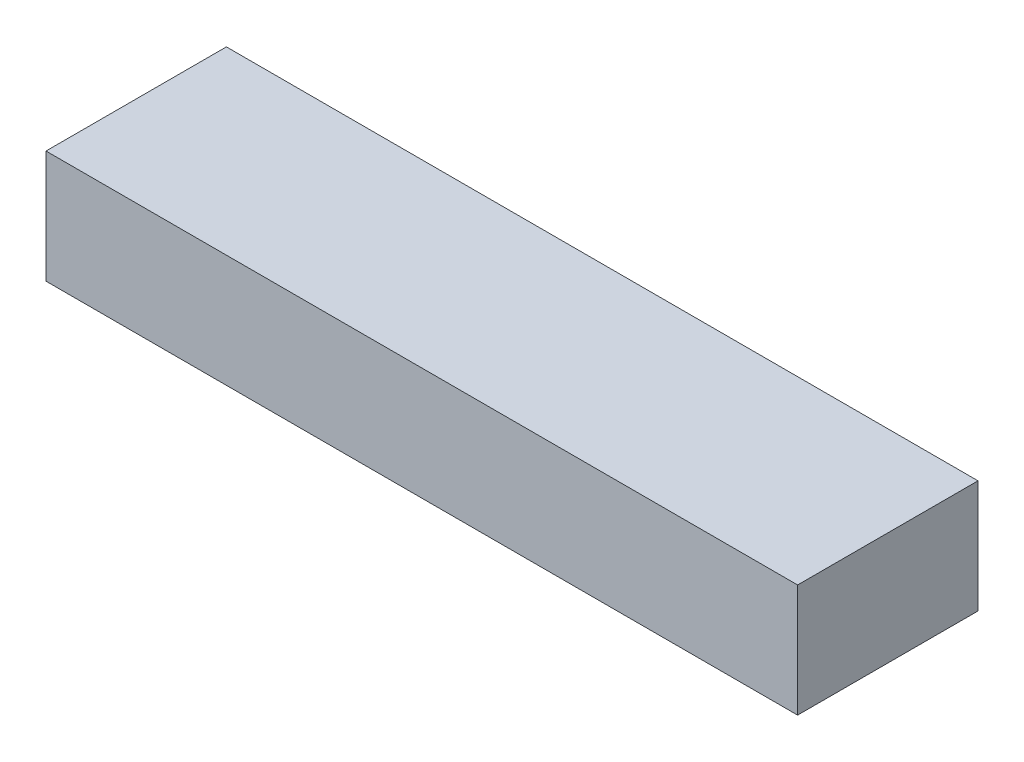
ISO-10303-21;
HEADER;
FILE_DESCRIPTION(('STEP AP214'),'2;1');
FILE_NAME('part.step','',(''),(''),'','','');
FILE_SCHEMA(('AUTOMOTIVE_DESIGN { 1 0 10303 214 1 1 1 1 }'));
ENDSEC;
DATA;
#1=APPLICATION_CONTEXT('core data for automotive mechanical design processes');
#2=APPLICATION_PROTOCOL_DEFINITION('international standard','automotive_design',2000,#1);
#3=PRODUCT_CONTEXT('',#1,'mechanical');
#4=PRODUCT('Part','Part','',(#3));
#5=PRODUCT_RELATED_PRODUCT_CATEGORY('part','',(#4));
#6=PRODUCT_DEFINITION_FORMATION('','',#4);
#7=PRODUCT_DEFINITION_CONTEXT('part definition',#1,'design');
#8=PRODUCT_DEFINITION('design','',#6,#7);
#9=PRODUCT_DEFINITION_SHAPE('','',#8);
#10=(LENGTH_UNIT() NAMED_UNIT(*) SI_UNIT(.MILLI.,.METRE.));
#11=(NAMED_UNIT(*) PLANE_ANGLE_UNIT() SI_UNIT($,.RADIAN.));
#12=(NAMED_UNIT(*) SI_UNIT($,.STERADIAN.) SOLID_ANGLE_UNIT());
#13=UNCERTAINTY_MEASURE_WITH_UNIT(LENGTH_MEASURE(1.E-05),#10,'distance_accuracy_value','');
#14=(GEOMETRIC_REPRESENTATION_CONTEXT(3) GLOBAL_UNCERTAINTY_ASSIGNED_CONTEXT((#13)) GLOBAL_UNIT_ASSIGNED_CONTEXT((#10,
#11,#12)) REPRESENTATION_CONTEXT('',''));
#15=CARTESIAN_POINT('',(0.,0.,0.));
#16=DIRECTION('',(0.,0.,1.));
#17=DIRECTION('',(1.,0.,0.));
#18=AXIS2_PLACEMENT_3D('',#15,#16,#17);
#19=CARTESIAN_POINT('',(-25.,7.5,6.));
#20=DIRECTION('',(1.,0.,0.));
#21=DIRECTION('',(0.,0.,-1.));
#22=AXIS2_PLACEMENT_3D('',#19,#20,#21);
#23=PLANE('',#22);
#24=DIRECTION('',(0.,0.,1.));
#25=VECTOR('',#24,1.);
#26=CARTESIAN_POINT('',(-25.,0.,6.));
#27=LINE('',#26,#25);
#28=CARTESIAN_POINT('',(-25.,0.,-6.));
#29=VERTEX_POINT('',#28);
#30=CARTESIAN_POINT('',(-25.,0.,6.));
#31=VERTEX_POINT('',#30);
#32=EDGE_CURVE('E99',#29,#31,#27,.T.);
#33=ORIENTED_EDGE('',*,*,#32,.T.);
#34=DIRECTION('',(0.,-1.,0.));
#35=VECTOR('',#34,1.);
#36=CARTESIAN_POINT('',(-25.,7.5,6.));
#37=LINE('',#36,#35);
#38=CARTESIAN_POINT('',(-25.,7.5,6.));
#39=VERTEX_POINT('',#38);
#40=EDGE_CURVE('E11',#39,#31,#37,.T.);
#41=ORIENTED_EDGE('',*,*,#40,.F.);
#42=DIRECTION('',(0.,0.,1.));
#43=VECTOR('',#42,1.);
#44=CARTESIAN_POINT('',(-25.,7.5,6.));
#45=LINE('',#44,#43);
#46=CARTESIAN_POINT('',(-25.,7.5,-6.));
#47=VERTEX_POINT('',#46);
#48=EDGE_CURVE('E87',#47,#39,#45,.T.);
#49=ORIENTED_EDGE('',*,*,#48,.F.);
#50=DIRECTION('',(0.,-1.,0.));
#51=VECTOR('',#50,1.);
#52=CARTESIAN_POINT('',(-25.,7.5,-6.));
#53=LINE('',#52,#51);
#54=EDGE_CURVE('E95',#47,#29,#53,.T.);
#55=ORIENTED_EDGE('',*,*,#54,.T.);
#56=EDGE_LOOP('',(#33,#41,#49,#55));
#57=FACE_BOUND('',#56,.T.);
#58=ADVANCED_FACE('F36',(#57),#23,.F.);
#59=CARTESIAN_POINT('',(25.,7.5,6.));
#60=DIRECTION('',(0.,0.,-1.));
#61=DIRECTION('',(-1.,0.,0.));
#62=AXIS2_PLACEMENT_3D('',#59,#60,#61);
#63=PLANE('',#62);
#64=DIRECTION('',(1.,0.,0.));
#65=VECTOR('',#64,1.);
#66=CARTESIAN_POINT('',(25.,0.,6.));
#67=LINE('',#66,#65);
#68=CARTESIAN_POINT('',(25.,0.,6.));
#69=VERTEX_POINT('',#68);
#70=EDGE_CURVE('E91',#31,#69,#67,.T.);
#71=ORIENTED_EDGE('',*,*,#70,.T.);
#72=DIRECTION('',(0.,-1.,0.));
#73=VECTOR('',#72,1.);
#74=CARTESIAN_POINT('',(25.,7.5,6.));
#75=LINE('',#74,#73);
#76=CARTESIAN_POINT('',(25.,7.5,6.));
#77=VERTEX_POINT('',#76);
#78=EDGE_CURVE('E44',#77,#69,#75,.T.);
#79=ORIENTED_EDGE('',*,*,#78,.F.);
#80=DIRECTION('',(1.,0.,0.));
#81=VECTOR('',#80,1.);
#82=CARTESIAN_POINT('',(25.,7.5,6.));
#83=LINE('',#82,#81);
#84=EDGE_CURVE('E82',#39,#77,#83,.T.);
#85=ORIENTED_EDGE('',*,*,#84,.F.);
#86=ORIENTED_EDGE('',*,*,#40,.T.);
#87=EDGE_LOOP('',(#71,#79,#85,#86));
#88=FACE_BOUND('',#87,.T.);
#89=ADVANCED_FACE('F90',(#88),#63,.F.);
#90=CARTESIAN_POINT('',(25.,7.5,6.));
#91=DIRECTION('',(-1.,0.,0.));
#92=DIRECTION('',(0.,0.,1.));
#93=AXIS2_PLACEMENT_3D('',#90,#91,#92);
#94=PLANE('',#93);
#95=DIRECTION('',(0.,0.,-1.));
#96=VECTOR('',#95,1.);
#97=CARTESIAN_POINT('',(25.,0.,6.));
#98=LINE('',#97,#96);
#99=CARTESIAN_POINT('',(25.,0.,-6.));
#100=VERTEX_POINT('',#99);
#101=EDGE_CURVE('E69',#69,#100,#98,.T.);
#102=ORIENTED_EDGE('',*,*,#101,.T.);
#103=DIRECTION('',(0.,-1.,0.));
#104=VECTOR('',#103,1.);
#105=CARTESIAN_POINT('',(25.,7.5,-6.));
#106=LINE('',#105,#104);
#107=CARTESIAN_POINT('',(25.,7.5,-6.));
#108=VERTEX_POINT('',#107);
#109=EDGE_CURVE('E92',#108,#100,#106,.T.);
#110=ORIENTED_EDGE('',*,*,#109,.F.);
#111=DIRECTION('',(0.,0.,-1.));
#112=VECTOR('',#111,1.);
#113=CARTESIAN_POINT('',(25.,7.5,6.));
#114=LINE('',#113,#112);
#115=EDGE_CURVE('E85',#77,#108,#114,.T.);
#116=ORIENTED_EDGE('',*,*,#115,.F.);
#117=ORIENTED_EDGE('',*,*,#78,.T.);
#118=EDGE_LOOP('',(#102,#110,#116,#117));
#119=FACE_BOUND('',#118,.T.);
#120=ADVANCED_FACE('F93',(#119),#94,.F.);
#121=CARTESIAN_POINT('',(25.,7.5,-6.));
#122=DIRECTION('',(0.,0.,1.));
#123=DIRECTION('',(1.,0.,0.));
#124=AXIS2_PLACEMENT_3D('',#121,#122,#123);
#125=PLANE('',#124);
#126=DIRECTION('',(-1.,0.,0.));
#127=VECTOR('',#126,1.);
#128=CARTESIAN_POINT('',(25.,0.,-6.));
#129=LINE('',#128,#127);
#130=EDGE_CURVE('E75',#100,#29,#129,.T.);
#131=ORIENTED_EDGE('',*,*,#130,.T.);
#132=ORIENTED_EDGE('',*,*,#54,.F.);
#133=DIRECTION('',(-1.,0.,0.));
#134=VECTOR('',#133,1.);
#135=CARTESIAN_POINT('',(25.,7.5,-6.));
#136=LINE('',#135,#134);
#137=EDGE_CURVE('E52',#108,#47,#136,.T.);
#138=ORIENTED_EDGE('',*,*,#137,.F.);
#139=ORIENTED_EDGE('',*,*,#109,.T.);
#140=EDGE_LOOP('',(#131,#132,#138,#139));
#141=FACE_BOUND('',#140,.T.);
#142=ADVANCED_FACE('F106',(#141),#125,.F.);
#143=CARTESIAN_POINT('',(0.,7.5,0.));
#144=DIRECTION('',(0.,1.,0.));
#145=DIRECTION('',(0.,0.,1.));
#146=AXIS2_PLACEMENT_3D('',#143,#144,#145);
#147=PLANE('',#146);
#148=ORIENTED_EDGE('',*,*,#48,.T.);
#149=ORIENTED_EDGE('',*,*,#84,.T.);
#150=ORIENTED_EDGE('',*,*,#115,.T.);
#151=ORIENTED_EDGE('',*,*,#137,.T.);
#152=EDGE_LOOP('',(#148,#149,#150,#151));
#153=FACE_BOUND('',#152,.T.);
#154=ADVANCED_FACE('F83',(#153),#147,.T.);
#155=CARTESIAN_POINT('',(0.,0.,0.));
#156=DIRECTION('',(0.,1.,0.));
#157=DIRECTION('',(0.,0.,1.));
#158=AXIS2_PLACEMENT_3D('',#155,#156,#157);
#159=PLANE('',#158);
#160=ORIENTED_EDGE('',*,*,#32,.F.);
#161=ORIENTED_EDGE('',*,*,#130,.F.);
#162=ORIENTED_EDGE('',*,*,#101,.F.);
#163=ORIENTED_EDGE('',*,*,#70,.F.);
#164=EDGE_LOOP('',(#160,#161,#162,#163));
#165=FACE_BOUND('',#164,.T.);
#166=ADVANCED_FACE('F109',(#165),#159,.F.);
#167=CLOSED_SHELL('',(#58,#89,#120,#142,#154,#166));
#168=MANIFOLD_SOLID_BREP('B2',#167);
#169=ADVANCED_BREP_SHAPE_REPRESENTATION('',(#18,#168),#14);
#170=SHAPE_DEFINITION_REPRESENTATION(#9,#169);
ENDSEC;
END-ISO-10303-21;
